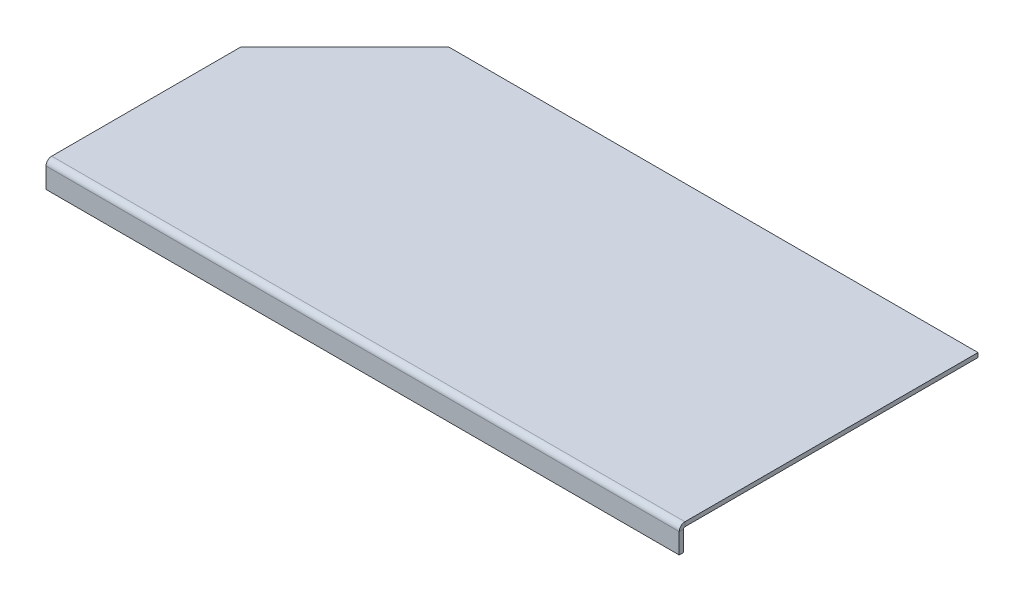
ISO-10303-21;
HEADER;
FILE_DESCRIPTION(('STEP AP214'),'2;1');
FILE_NAME('part.step','',(''),(''),'','','');
FILE_SCHEMA(('AUTOMOTIVE_DESIGN { 1 0 10303 214 1 1 1 1 }'));
ENDSEC;
DATA;
#1=APPLICATION_CONTEXT('core data for automotive mechanical design processes');
#2=APPLICATION_PROTOCOL_DEFINITION('international standard','automotive_design',2000,#1);
#3=PRODUCT_CONTEXT('',#1,'mechanical');
#4=PRODUCT('Part','Part','',(#3));
#5=PRODUCT_RELATED_PRODUCT_CATEGORY('part','',(#4));
#6=PRODUCT_DEFINITION_FORMATION('','',#4);
#7=PRODUCT_DEFINITION_CONTEXT('part definition',#1,'design');
#8=PRODUCT_DEFINITION('design','',#6,#7);
#9=PRODUCT_DEFINITION_SHAPE('','',#8);
#10=(LENGTH_UNIT() NAMED_UNIT(*) SI_UNIT(.MILLI.,.METRE.));
#11=(NAMED_UNIT(*) PLANE_ANGLE_UNIT() SI_UNIT($,.RADIAN.));
#12=(NAMED_UNIT(*) SI_UNIT($,.STERADIAN.) SOLID_ANGLE_UNIT());
#13=UNCERTAINTY_MEASURE_WITH_UNIT(LENGTH_MEASURE(1.E-05),#10,'distance_accuracy_value','');
#14=(GEOMETRIC_REPRESENTATION_CONTEXT(3) GLOBAL_UNCERTAINTY_ASSIGNED_CONTEXT((#13)) GLOBAL_UNIT_ASSIGNED_CONTEXT((#10,
#11,#12)) REPRESENTATION_CONTEXT('',''));
#15=CARTESIAN_POINT('',(0.,0.,0.));
#16=DIRECTION('',(0.,0.,1.));
#17=DIRECTION('',(1.,0.,0.));
#18=AXIS2_PLACEMENT_3D('',#15,#16,#17);
#19=CARTESIAN_POINT('',(-232.0925,-3.175,-63.78575));
#20=DIRECTION('',(-1.,0.,0.));
#21=DIRECTION('',(0.,0.,1.));
#22=AXIS2_PLACEMENT_3D('',#19,#20,#21);
#23=PLANE('',#22);
#24=DIRECTION('',(0.,0.,1.));
#25=VECTOR('',#24,1.);
#26=CARTESIAN_POINT('',(-232.0925,-3.175,-63.78575));
#27=LINE('',#26,#25);
#28=CARTESIAN_POINT('',(-232.0925,-3.175,-76.48575));
#29=VERTEX_POINT('',#28);
#30=CARTESIAN_POINT('',(-232.0925,-3.17499999999999,62.15075));
#31=VERTEX_POINT('',#30);
#32=EDGE_CURVE('E13',#29,#31,#27,.T.);
#33=ORIENTED_EDGE('',*,*,#32,.T.);
#34=DIRECTION('',(0.,1.,0.));
#35=VECTOR('',#34,1.);
#36=CARTESIAN_POINT('',(-232.0925,-3.17499999999999,62.15075));
#37=LINE('',#36,#35);
#38=CARTESIAN_POINT('',(-232.0925,0.,62.15075));
#39=VERTEX_POINT('',#38);
#40=EDGE_CURVE('E185',#31,#39,#37,.T.);
#41=ORIENTED_EDGE('',*,*,#40,.T.);
#42=DIRECTION('',(0.,0.,1.));
#43=VECTOR('',#42,1.);
#44=CARTESIAN_POINT('',(-232.0925,0.,-63.78575));
#45=LINE('',#44,#43);
#46=CARTESIAN_POINT('',(-232.0925,0.,-76.48575));
#47=VERTEX_POINT('',#46);
#48=EDGE_CURVE('E60',#47,#39,#45,.T.);
#49=ORIENTED_EDGE('',*,*,#48,.F.);
#50=DIRECTION('',(0.,1.,0.));
#51=VECTOR('',#50,1.);
#52=CARTESIAN_POINT('',(-232.0925,-3.175,-76.48575));
#53=LINE('',#52,#51);
#54=EDGE_CURVE('E212',#29,#47,#53,.T.);
#55=ORIENTED_EDGE('',*,*,#54,.F.);
#56=EDGE_LOOP('',(#33,#41,#49,#55));
#57=FACE_BOUND('',#56,.T.);
#58=ADVANCED_FACE('F56',(#57),#23,.T.);
#59=CARTESIAN_POINT('',(0.,-3.175,0.));
#60=DIRECTION('',(0.,1.,0.));
#61=DIRECTION('',(0.,0.,1.));
#62=AXIS2_PLACEMENT_3D('',#59,#60,#61);
#63=PLANE('',#62);
#64=DIRECTION('',(-1.,0.,0.));
#65=VECTOR('',#64,1.);
#66=CARTESIAN_POINT('',(-232.0925,-3.17499999999999,62.15075));
#67=LINE('',#66,#65);
#68=CARTESIAN_POINT('',(232.0925,-3.17499999999999,62.15075));
#69=VERTEX_POINT('',#68);
#70=EDGE_CURVE('E191',#31,#69,#67,.F.);
#71=ORIENTED_EDGE('',*,*,#70,.F.);
#72=ORIENTED_EDGE('',*,*,#32,.F.);
#73=DIRECTION('',(-0.707106781186546,0.,0.707106781186549));
#74=VECTOR('',#73,1.);
#75=CARTESIAN_POINT('',(-155.8925,-3.175,-152.68575));
#76=LINE('',#75,#74);
#77=CARTESIAN_POINT('',(-155.8925,-3.175,-152.68575));
#78=VERTEX_POINT('',#77);
#79=EDGE_CURVE('E203',#78,#29,#76,.T.);
#80=ORIENTED_EDGE('',*,*,#79,.F.);
#81=DIRECTION('',(-1.,0.,0.));
#82=VECTOR('',#81,1.);
#83=CARTESIAN_POINT('',(232.0925,-3.175,-152.68575));
#84=LINE('',#83,#82);
#85=CARTESIAN_POINT('',(232.0925,-3.175,-152.68575));
#86=VERTEX_POINT('',#85);
#87=EDGE_CURVE('E200',#86,#78,#84,.T.);
#88=ORIENTED_EDGE('',*,*,#87,.F.);
#89=DIRECTION('',(0.,0.,-1.));
#90=VECTOR('',#89,1.);
#91=CARTESIAN_POINT('',(232.0925,-3.175,-63.78575));
#92=LINE('',#91,#90);
#93=EDGE_CURVE('E65',#69,#86,#92,.T.);
#94=ORIENTED_EDGE('',*,*,#93,.F.);
#95=EDGE_LOOP('',(#71,#72,#80,#88,#94));
#96=FACE_BOUND('',#95,.T.);
#97=ADVANCED_FACE('F233',(#96),#63,.F.);
#98=CARTESIAN_POINT('',(0.,0.,0.));
#99=DIRECTION('',(0.,1.,0.));
#100=DIRECTION('',(0.,0.,1.));
#101=AXIS2_PLACEMENT_3D('',#98,#99,#100);
#102=PLANE('',#101);
#103=ORIENTED_EDGE('',*,*,#48,.T.);
#104=DIRECTION('',(-1.,0.,0.));
#105=VECTOR('',#104,1.);
#106=CARTESIAN_POINT('',(-232.0925,0.,62.15075));
#107=LINE('',#106,#105);
#108=CARTESIAN_POINT('',(232.0925,0.,62.15075));
#109=VERTEX_POINT('',#108);
#110=EDGE_CURVE('E180',#39,#109,#107,.F.);
#111=ORIENTED_EDGE('',*,*,#110,.T.);
#112=DIRECTION('',(0.,0.,-1.));
#113=VECTOR('',#112,1.);
#114=CARTESIAN_POINT('',(232.0925,0.,-63.78575));
#115=LINE('',#114,#113);
#116=CARTESIAN_POINT('',(232.0925,0.,-152.68575));
#117=VERTEX_POINT('',#116);
#118=EDGE_CURVE('E214',#109,#117,#115,.T.);
#119=ORIENTED_EDGE('',*,*,#118,.T.);
#120=DIRECTION('',(-1.,0.,0.));
#121=VECTOR('',#120,1.);
#122=CARTESIAN_POINT('',(232.0925,0.,-152.68575));
#123=LINE('',#122,#121);
#124=CARTESIAN_POINT('',(-155.8925,0.,-152.68575));
#125=VERTEX_POINT('',#124);
#126=EDGE_CURVE('E198',#117,#125,#123,.T.);
#127=ORIENTED_EDGE('',*,*,#126,.T.);
#128=DIRECTION('',(-0.707106781186546,0.,0.707106781186549));
#129=VECTOR('',#128,1.);
#130=CARTESIAN_POINT('',(-155.8925,0.,-152.68575));
#131=LINE('',#130,#129);
#132=EDGE_CURVE('E204',#125,#47,#131,.T.);
#133=ORIENTED_EDGE('',*,*,#132,.T.);
#134=EDGE_LOOP('',(#103,#111,#119,#127,#133));
#135=FACE_BOUND('',#134,.T.);
#136=ADVANCED_FACE('F220',(#135),#102,.T.);
#137=CARTESIAN_POINT('',(232.0925,-3.175,-63.78575));
#138=DIRECTION('',(1.,0.,0.));
#139=DIRECTION('',(0.,0.,-1.));
#140=AXIS2_PLACEMENT_3D('',#137,#138,#139);
#141=PLANE('',#140);
#142=DIRECTION('',(0.,1.,0.));
#143=VECTOR('',#142,1.);
#144=CARTESIAN_POINT('',(232.0925,-3.17499999999999,62.15075));
#145=LINE('',#144,#143);
#146=EDGE_CURVE('E196',#69,#109,#145,.T.);
#147=ORIENTED_EDGE('',*,*,#146,.F.);
#148=ORIENTED_EDGE('',*,*,#93,.T.);
#149=DIRECTION('',(0.,1.,0.));
#150=VECTOR('',#149,1.);
#151=CARTESIAN_POINT('',(232.0925,-3.175,-152.68575));
#152=LINE('',#151,#150);
#153=EDGE_CURVE('E207',#86,#117,#152,.T.);
#154=ORIENTED_EDGE('',*,*,#153,.T.);
#155=ORIENTED_EDGE('',*,*,#118,.F.);
#156=EDGE_LOOP('',(#147,#148,#154,#155));
#157=FACE_BOUND('',#156,.T.);
#158=ADVANCED_FACE('F58',(#157),#141,.T.);
#159=CARTESIAN_POINT('',(-155.8925,-3.175,-152.68575));
#160=DIRECTION('',(-0.707106781186549,0.,-0.707106781186546));
#161=DIRECTION('',(-0.707106781186546,0.,0.707106781186549));
#162=AXIS2_PLACEMENT_3D('',#159,#160,#161);
#163=PLANE('',#162);
#164=ORIENTED_EDGE('',*,*,#132,.F.);
#165=DIRECTION('',(0.,1.,0.));
#166=VECTOR('',#165,1.);
#167=CARTESIAN_POINT('',(-155.8925,-3.175,-152.68575));
#168=LINE('',#167,#166);
#169=EDGE_CURVE('E215',#78,#125,#168,.T.);
#170=ORIENTED_EDGE('',*,*,#169,.F.);
#171=ORIENTED_EDGE('',*,*,#79,.T.);
#172=ORIENTED_EDGE('',*,*,#54,.T.);
#173=EDGE_LOOP('',(#164,#170,#171,#172));
#174=FACE_BOUND('',#173,.T.);
#175=ADVANCED_FACE('F224',(#174),#163,.T.);
#176=CARTESIAN_POINT('',(232.0925,-3.175,-152.68575));
#177=DIRECTION('',(0.,0.,-1.));
#178=DIRECTION('',(-1.,0.,0.));
#179=AXIS2_PLACEMENT_3D('',#176,#177,#178);
#180=PLANE('',#179);
#181=ORIENTED_EDGE('',*,*,#126,.F.);
#182=ORIENTED_EDGE('',*,*,#153,.F.);
#183=ORIENTED_EDGE('',*,*,#87,.T.);
#184=ORIENTED_EDGE('',*,*,#169,.T.);
#185=EDGE_LOOP('',(#181,#182,#183,#184));
#186=FACE_BOUND('',#185,.T.);
#187=ADVANCED_FACE('F236',(#186),#180,.T.);
#188=CARTESIAN_POINT('',(232.0925,-4.17499999999999,62.15075));
#189=DIRECTION('',(1.,0.,0.));
#190=DIRECTION('',(0.,0.,-1.));
#191=AXIS2_PLACEMENT_3D('',#188,#189,#190);
#192=PLANE('',#191);
#193=DIRECTION('',(0.,0.,-1.));
#194=VECTOR('',#193,1.);
#195=CARTESIAN_POINT('',(232.0925,-4.175,66.32575));
#196=LINE('',#195,#194);
#197=CARTESIAN_POINT('',(232.0925,-4.17499999999999,63.15075));
#198=VERTEX_POINT('',#197);
#199=CARTESIAN_POINT('',(232.0925,-4.17499999999998,66.32575));
#200=VERTEX_POINT('',#199);
#201=EDGE_CURVE('E162',#198,#200,#196,.F.);
#202=ORIENTED_EDGE('',*,*,#201,.F.);
#203=CARTESIAN_POINT('',(232.0925,-4.17499999999999,62.15075));
#204=DIRECTION('',(-1.,0.,0.));
#205=DIRECTION('',(0.,0.,1.));
#206=AXIS2_PLACEMENT_3D('',#203,#204,#205);
#207=CIRCLE('',#206,1.);
#208=EDGE_CURVE('E188',#69,#198,#207,.F.);
#209=ORIENTED_EDGE('',*,*,#208,.F.);
#210=ORIENTED_EDGE('',*,*,#146,.T.);
#211=CARTESIAN_POINT('',(232.0925,-4.17499999999999,62.15075));
#212=DIRECTION('',(-1.,0.,0.));
#213=DIRECTION('',(0.,0.,1.));
#214=AXIS2_PLACEMENT_3D('',#211,#212,#213);
#215=CIRCLE('',#214,4.175);
#216=EDGE_CURVE('E73',#109,#200,#215,.F.);
#217=ORIENTED_EDGE('',*,*,#216,.T.);
#218=EDGE_LOOP('',(#202,#209,#210,#217));
#219=FACE_BOUND('',#218,.T.);
#220=ADVANCED_FACE('F238',(#219),#192,.T.);
#221=CARTESIAN_POINT('',(-232.0925,-4.17499999999999,62.15075));
#222=DIRECTION('',(1.,0.,0.));
#223=DIRECTION('',(0.,0.,-1.));
#224=AXIS2_PLACEMENT_3D('',#221,#222,#223);
#225=PLANE('',#224);
#226=CARTESIAN_POINT('',(-232.0925,-4.17499999999999,62.15075));
#227=DIRECTION('',(-1.,0.,0.));
#228=DIRECTION('',(0.,0.,1.));
#229=AXIS2_PLACEMENT_3D('',#226,#227,#228);
#230=CIRCLE('',#229,1.);
#231=CARTESIAN_POINT('',(-232.0925,-4.17499999999999,63.15075));
#232=VERTEX_POINT('',#231);
#233=EDGE_CURVE('E193',#232,#31,#230,.T.);
#234=ORIENTED_EDGE('',*,*,#233,.F.);
#235=DIRECTION('',(0.,0.,-1.));
#236=VECTOR('',#235,1.);
#237=CARTESIAN_POINT('',(-232.0925,-4.17499999999998,63.15075));
#238=LINE('',#237,#236);
#239=CARTESIAN_POINT('',(-232.0925,-4.17499999999998,66.32575));
#240=VERTEX_POINT('',#239);
#241=EDGE_CURVE('E174',#232,#240,#238,.F.);
#242=ORIENTED_EDGE('',*,*,#241,.T.);
#243=CARTESIAN_POINT('',(-232.0925,-4.17499999999999,62.15075));
#244=DIRECTION('',(-1.,0.,0.));
#245=DIRECTION('',(0.,0.,1.));
#246=AXIS2_PLACEMENT_3D('',#243,#244,#245);
#247=CIRCLE('',#246,4.175);
#248=EDGE_CURVE('E183',#240,#39,#247,.T.);
#249=ORIENTED_EDGE('',*,*,#248,.T.);
#250=ORIENTED_EDGE('',*,*,#40,.F.);
#251=EDGE_LOOP('',(#234,#242,#249,#250));
#252=FACE_BOUND('',#251,.T.);
#253=ADVANCED_FACE('F227',(#252),#225,.F.);
#254=CARTESIAN_POINT('',(-232.0925,-4.17499999999999,62.15075));
#255=DIRECTION('',(-1.,0.,0.));
#256=DIRECTION('',(0.,0.,1.));
#257=AXIS2_PLACEMENT_3D('',#254,#255,#256);
#258=CYLINDRICAL_SURFACE('',#257,4.175);
#259=ORIENTED_EDGE('',*,*,#110,.F.);
#260=ORIENTED_EDGE('',*,*,#248,.F.);
#261=DIRECTION('',(-1.,0.,0.));
#262=VECTOR('',#261,1.);
#263=CARTESIAN_POINT('',(232.0925,-4.175,66.32575));
#264=LINE('',#263,#262);
#265=EDGE_CURVE('E172',#240,#200,#264,.F.);
#266=ORIENTED_EDGE('',*,*,#265,.T.);
#267=ORIENTED_EDGE('',*,*,#216,.F.);
#268=EDGE_LOOP('',(#259,#260,#266,#267));
#269=FACE_BOUND('',#268,.T.);
#270=ADVANCED_FACE('F244',(#269),#258,.T.);
#271=CARTESIAN_POINT('',(-232.0925,-4.17499999999999,62.15075));
#272=DIRECTION('',(-1.,0.,0.));
#273=DIRECTION('',(0.,0.,1.));
#274=AXIS2_PLACEMENT_3D('',#271,#272,#273);
#275=CYLINDRICAL_SURFACE('',#274,1.);
#276=ORIENTED_EDGE('',*,*,#70,.T.);
#277=ORIENTED_EDGE('',*,*,#208,.T.);
#278=DIRECTION('',(-1.,0.,0.));
#279=VECTOR('',#278,1.);
#280=CARTESIAN_POINT('',(232.0925,-4.175,63.15075));
#281=LINE('',#280,#279);
#282=EDGE_CURVE('E177',#198,#232,#281,.T.);
#283=ORIENTED_EDGE('',*,*,#282,.T.);
#284=ORIENTED_EDGE('',*,*,#233,.T.);
#285=EDGE_LOOP('',(#276,#277,#283,#284));
#286=FACE_BOUND('',#285,.T.);
#287=ADVANCED_FACE('F230',(#286),#275,.F.);
#288=CARTESIAN_POINT('',(-232.0925,-19.05,66.3257500000001));
#289=DIRECTION('',(1.,0.,0.));
#290=DIRECTION('',(0.,0.,-1.));
#291=AXIS2_PLACEMENT_3D('',#288,#289,#290);
#292=PLANE('',#291);
#293=ORIENTED_EDGE('',*,*,#241,.F.);
#294=DIRECTION('',(0.,1.,0.));
#295=VECTOR('',#294,1.);
#296=CARTESIAN_POINT('',(-232.0925,-19.05,63.1507500000001));
#297=LINE('',#296,#295);
#298=CARTESIAN_POINT('',(-232.0925,-19.05,63.1507500000001));
#299=VERTEX_POINT('',#298);
#300=EDGE_CURVE('E170',#232,#299,#297,.F.);
#301=ORIENTED_EDGE('',*,*,#300,.T.);
#302=DIRECTION('',(0.,0.,-1.));
#303=VECTOR('',#302,1.);
#304=CARTESIAN_POINT('',(-232.0925,-19.05,66.3257500000001));
#305=LINE('',#304,#303);
#306=CARTESIAN_POINT('',(-232.0925,-19.05,66.3257500000001));
#307=VERTEX_POINT('',#306);
#308=EDGE_CURVE('E158',#307,#299,#305,.T.);
#309=ORIENTED_EDGE('',*,*,#308,.F.);
#310=DIRECTION('',(0.,-1.,0.));
#311=VECTOR('',#310,1.);
#312=CARTESIAN_POINT('',(-232.0925,2.34129258898021E-13,66.32575));
#313=LINE('',#312,#311);
#314=EDGE_CURVE('E145',#240,#307,#313,.T.);
#315=ORIENTED_EDGE('',*,*,#314,.F.);
#316=EDGE_LOOP('',(#293,#301,#309,#315));
#317=FACE_BOUND('',#316,.T.);
#318=ADVANCED_FACE('F243',(#317),#292,.F.);
#319=CARTESIAN_POINT('',(232.0925,-3.17499999999999,66.32575));
#320=DIRECTION('',(-1.,0.,0.));
#321=DIRECTION('',(0.,0.,1.));
#322=AXIS2_PLACEMENT_3D('',#319,#320,#321);
#323=PLANE('',#322);
#324=ORIENTED_EDGE('',*,*,#201,.T.);
#325=DIRECTION('',(0.,1.,0.));
#326=VECTOR('',#325,1.);
#327=CARTESIAN_POINT('',(232.0925,2.34129258898021E-13,66.32575));
#328=LINE('',#327,#326);
#329=CARTESIAN_POINT('',(232.0925,-19.05,66.3257500000001));
#330=VERTEX_POINT('',#329);
#331=EDGE_CURVE('E143',#330,#200,#328,.T.);
#332=ORIENTED_EDGE('',*,*,#331,.F.);
#333=DIRECTION('',(0.,0.,-1.));
#334=VECTOR('',#333,1.);
#335=CARTESIAN_POINT('',(232.0925,-19.05,66.3257500000001));
#336=LINE('',#335,#334);
#337=CARTESIAN_POINT('',(232.0925,-19.05,63.1507500000001));
#338=VERTEX_POINT('',#337);
#339=EDGE_CURVE('E151',#330,#338,#336,.T.);
#340=ORIENTED_EDGE('',*,*,#339,.T.);
#341=DIRECTION('',(0.,-1.,0.));
#342=VECTOR('',#341,1.);
#343=CARTESIAN_POINT('',(232.0925,-3.175,63.15075));
#344=LINE('',#343,#342);
#345=EDGE_CURVE('E167',#338,#198,#344,.F.);
#346=ORIENTED_EDGE('',*,*,#345,.T.);
#347=EDGE_LOOP('',(#324,#332,#340,#346));
#348=FACE_BOUND('',#347,.T.);
#349=ADVANCED_FACE('F161',(#348),#323,.F.);
#350=CARTESIAN_POINT('',(0.,2.34129258898021E-13,66.32575));
#351=DIRECTION('',(0.,0.,-1.));
#352=DIRECTION('',(0.,1.,0.));
#353=AXIS2_PLACEMENT_3D('',#350,#351,#352);
#354=PLANE('',#353);
#355=ORIENTED_EDGE('',*,*,#265,.F.);
#356=ORIENTED_EDGE('',*,*,#314,.T.);
#357=DIRECTION('',(1.,0.,0.));
#358=VECTOR('',#357,1.);
#359=CARTESIAN_POINT('',(0.,-19.05,66.3257500000001));
#360=LINE('',#359,#358);
#361=EDGE_CURVE('E138',#307,#330,#360,.T.);
#362=ORIENTED_EDGE('',*,*,#361,.T.);
#363=ORIENTED_EDGE('',*,*,#331,.T.);
#364=EDGE_LOOP('',(#355,#356,#362,#363));
#365=FACE_BOUND('',#364,.T.);
#366=ADVANCED_FACE('F141',(#365),#354,.F.);
#367=CARTESIAN_POINT('',(0.,2.23043805647194E-13,63.15075));
#368=DIRECTION('',(0.,0.,-1.));
#369=DIRECTION('',(0.,1.,0.));
#370=AXIS2_PLACEMENT_3D('',#367,#368,#369);
#371=PLANE('',#370);
#372=ORIENTED_EDGE('',*,*,#300,.F.);
#373=ORIENTED_EDGE('',*,*,#282,.F.);
#374=ORIENTED_EDGE('',*,*,#345,.F.);
#375=DIRECTION('',(-1.,0.,0.));
#376=VECTOR('',#375,1.);
#377=CARTESIAN_POINT('',(232.0925,-19.05,63.1507500000001));
#378=LINE('',#377,#376);
#379=EDGE_CURVE('E154',#299,#338,#378,.F.);
#380=ORIENTED_EDGE('',*,*,#379,.F.);
#381=EDGE_LOOP('',(#372,#373,#374,#380));
#382=FACE_BOUND('',#381,.T.);
#383=ADVANCED_FACE('F241',(#382),#371,.T.);
#384=CARTESIAN_POINT('',(232.0925,-19.05,66.3257500000001));
#385=DIRECTION('',(0.,1.,0.));
#386=DIRECTION('',(0.,0.,1.));
#387=AXIS2_PLACEMENT_3D('',#384,#385,#386);
#388=PLANE('',#387);
#389=ORIENTED_EDGE('',*,*,#379,.T.);
#390=ORIENTED_EDGE('',*,*,#339,.F.);
#391=ORIENTED_EDGE('',*,*,#361,.F.);
#392=ORIENTED_EDGE('',*,*,#308,.T.);
#393=EDGE_LOOP('',(#389,#390,#391,#392));
#394=FACE_BOUND('',#393,.T.);
#395=ADVANCED_FACE('F152',(#394),#388,.F.);
#396=CLOSED_SHELL('',(#58,#97,#136,#158,#175,#187,#220,#253,#270,#287,#318,#349,#366,#383,#395));
#397=MANIFOLD_SOLID_BREP('B2',#396);
#398=ADVANCED_BREP_SHAPE_REPRESENTATION('',(#18,#397),#14);
#399=SHAPE_DEFINITION_REPRESENTATION(#9,#398);
ENDSEC;
END-ISO-10303-21;
